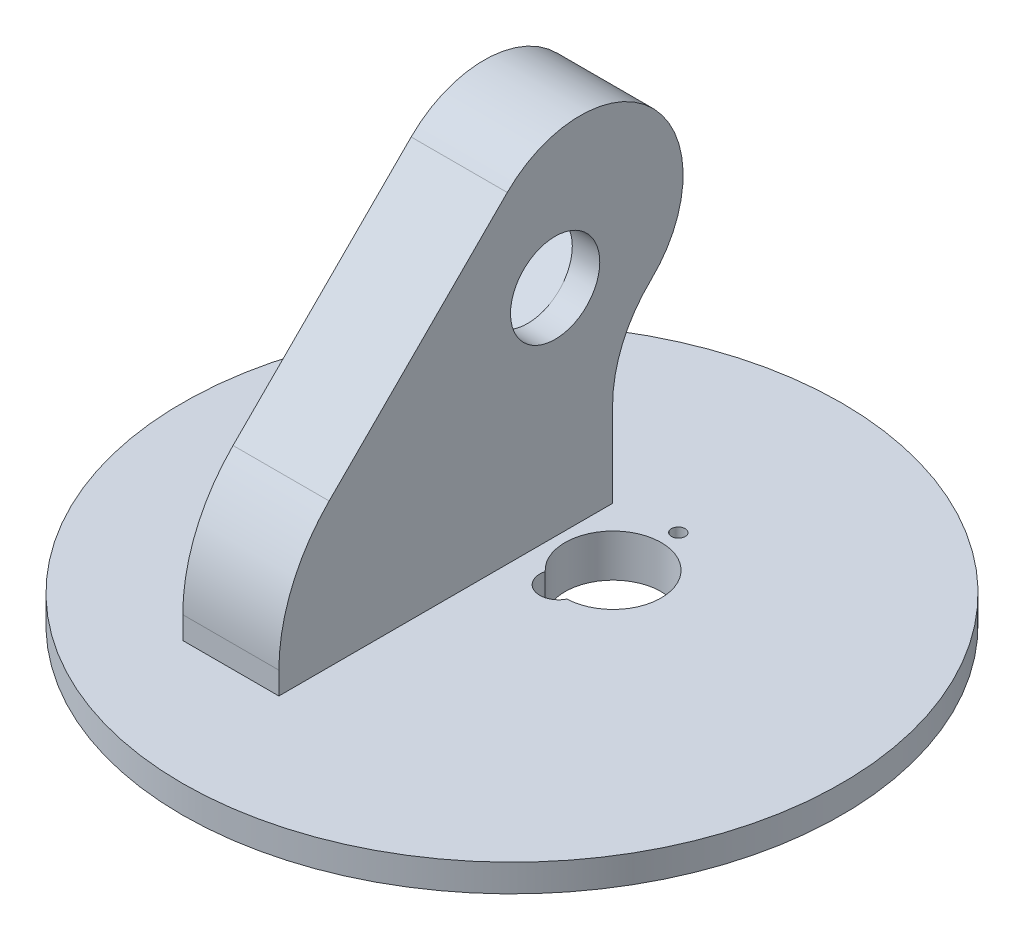
ISO-10303-21;
HEADER;
FILE_DESCRIPTION(('STEP AP214'),'2;1');
FILE_NAME('part.step','',(''),(''),'','','');
FILE_SCHEMA(('AUTOMOTIVE_DESIGN { 1 0 10303 214 1 1 1 1 }'));
ENDSEC;
DATA;
#1=APPLICATION_CONTEXT('core data for automotive mechanical design processes');
#2=APPLICATION_PROTOCOL_DEFINITION('international standard','automotive_design',2000,#1);
#3=PRODUCT_CONTEXT('',#1,'mechanical');
#4=PRODUCT('Part','Part','',(#3));
#5=PRODUCT_RELATED_PRODUCT_CATEGORY('part','',(#4));
#6=PRODUCT_DEFINITION_FORMATION('','',#4);
#7=PRODUCT_DEFINITION_CONTEXT('part definition',#1,'design');
#8=PRODUCT_DEFINITION('design','',#6,#7);
#9=PRODUCT_DEFINITION_SHAPE('','',#8);
#10=(LENGTH_UNIT() NAMED_UNIT(*) SI_UNIT(.MILLI.,.METRE.));
#11=(NAMED_UNIT(*) PLANE_ANGLE_UNIT() SI_UNIT($,.RADIAN.));
#12=(NAMED_UNIT(*) SI_UNIT($,.STERADIAN.) SOLID_ANGLE_UNIT());
#13=UNCERTAINTY_MEASURE_WITH_UNIT(LENGTH_MEASURE(1.E-05),#10,'distance_accuracy_value','');
#14=(GEOMETRIC_REPRESENTATION_CONTEXT(3) GLOBAL_UNCERTAINTY_ASSIGNED_CONTEXT((#13)) GLOBAL_UNIT_ASSIGNED_CONTEXT((#10,
#11,#12)) REPRESENTATION_CONTEXT('',''));
#15=CARTESIAN_POINT('',(0.,0.,0.));
#16=DIRECTION('',(0.,0.,1.));
#17=DIRECTION('',(1.,0.,0.));
#18=AXIS2_PLACEMENT_3D('',#15,#16,#17);
#19=CARTESIAN_POINT('',(-18.,0.,0.));
#20=DIRECTION('',(1.,0.,0.));
#21=DIRECTION('',(0.,0.,-1.));
#22=AXIS2_PLACEMENT_3D('',#19,#20,#21);
#23=PLANE('',#22);
#24=CARTESIAN_POINT('',(-18.,41.2645045857963,-17.0806200375207));
#25=DIRECTION('',(-1.,0.,0.));
#26=DIRECTION('',(0.,0.,1.));
#27=AXIS2_PLACEMENT_3D('',#24,#25,#26);
#28=CIRCLE('',#27,1.);
#29=CARTESIAN_POINT('',(-18.,41.2645045857963,-16.0806200375207));
#30=VERTEX_POINT('',#29);
#31=EDGE_CURVE('E180',#30,#30,#28,.T.);
#32=ORIENTED_EDGE('',*,*,#31,.F.);
#33=EDGE_LOOP('',(#32));
#34=FACE_BOUND('',#33,.T.);
#35=CARTESIAN_POINT('',(-18.,22.6925595294303,3.92944965370274));
#36=DIRECTION('',(-1.,0.,0.));
#37=DIRECTION('',(0.,0.,1.));
#38=AXIS2_PLACEMENT_3D('',#35,#36,#37);
#39=CIRCLE('',#38,0.999999999999999);
#40=CARTESIAN_POINT('',(-18.,22.6925595294303,4.92944965370274));
#41=VERTEX_POINT('',#40);
#42=EDGE_CURVE('E171',#41,#41,#39,.T.);
#43=ORIENTED_EDGE('',*,*,#42,.F.);
#44=EDGE_LOOP('',(#43));
#45=FACE_BOUND('',#44,.T.);
#46=DIRECTION('',(0.,0.707106781186544,-0.707106781186551));
#47=VECTOR('',#46,1.);
#48=CARTESIAN_POINT('',(-18.,23.7855886547707,23.7855886547705));
#49=LINE('',#48,#47);
#50=CARTESIAN_POINT('',(-18.,24.9400556402531,22.6311216692881));
#51=VERTEX_POINT('',#50);
#52=CARTESIAN_POINT('',(-18.,50.8830818937314,-3.31190458419046));
#53=VERTEX_POINT('',#52);
#54=EDGE_CURVE('E226',#51,#53,#49,.T.);
#55=ORIENTED_EDGE('',*,*,#54,.T.);
#56=CARTESIAN_POINT('',(-18.,40.2764801759331,-13.9185063019886));
#57=DIRECTION('',(1.,0.,0.));
#58=DIRECTION('',(0.,0.,-1.));
#59=AXIS2_PLACEMENT_3D('',#56,#57,#58);
#60=CIRCLE('',#59,15.);
#61=CARTESIAN_POINT('',(-18.,29.4035951531422,-24.2519651266595));
#62=VERTEX_POINT('',#61);
#63=EDGE_CURVE('E241',#62,#53,#60,.T.);
#64=ORIENTED_EDGE('',*,*,#63,.F.);
#65=CARTESIAN_POINT('',(-18.,16.356133125793,-36.6521157162645));
#66=DIRECTION('',(1.,0.,0.));
#67=DIRECTION('',(0.,0.,-1.));
#68=AXIS2_PLACEMENT_3D('',#65,#66,#67);
#69=CIRCLE('',#68,18.);
#70=CARTESIAN_POINT('',(-18.,16.356133125793,-18.6521157162645));
#71=VERTEX_POINT('',#70);
#72=EDGE_CURVE('E239',#62,#71,#69,.T.);
#73=ORIENTED_EDGE('',*,*,#72,.T.);
#74=DIRECTION('',(0.,-1.,0.));
#75=VECTOR('',#74,1.);
#76=CARTESIAN_POINT('',(-18.,0.,-18.6521157162645));
#77=LINE('',#76,#75);
#78=CARTESIAN_POINT('',(-18.,4.,-18.6521157162645));
#79=VERTEX_POINT('',#78);
#80=EDGE_CURVE('E236',#71,#79,#77,.T.);
#81=ORIENTED_EDGE('',*,*,#80,.T.);
#82=DIRECTION('',(0.,0.,-1.));
#83=VECTOR('',#82,1.);
#84=CARTESIAN_POINT('',(-18.,4.,0.));
#85=LINE('',#84,#83);
#86=CARTESIAN_POINT('',(-18.,4.,29.9534521396244));
#87=VERTEX_POINT('',#86);
#88=EDGE_CURVE('E234',#87,#79,#85,.T.);
#89=ORIENTED_EDGE('',*,*,#88,.F.);
#90=DIRECTION('',(0.,1.,0.));
#91=VECTOR('',#90,1.);
#92=CARTESIAN_POINT('',(-18.,-2.54836575938059E-13,29.9534521396244));
#93=LINE('',#92,#91);
#94=CARTESIAN_POINT('',(-18.,7.26238611058933,29.9534521396245));
#95=VERTEX_POINT('',#94);
#96=EDGE_CURVE('E232',#87,#95,#93,.T.);
#97=ORIENTED_EDGE('',*,*,#96,.T.);
#98=CARTESIAN_POINT('',(-18.,7.26238611058938,4.95345213962445));
#99=DIRECTION('',(1.,0.,0.));
#100=DIRECTION('',(0.,0.,-1.));
#101=AXIS2_PLACEMENT_3D('',#98,#99,#100);
#102=CIRCLE('',#101,25.);
#103=EDGE_CURVE('E228',#51,#95,#102,.T.);
#104=ORIENTED_EDGE('',*,*,#103,.F.);
#105=EDGE_LOOP('',(#55,#64,#73,#81,#89,#97,#104));
#106=FACE_BOUND('',#105,.T.);
#107=DIRECTION('',(0.,0.746307341756309,0.665601496122591));
#108=VECTOR('',#107,1.);
#109=CARTESIAN_POINT('',(-18.,34.8143999591404,-19.42779728588));
#110=LINE('',#109,#108);
#111=CARTESIAN_POINT('',(-18.,40.2181654592959,-14.6083962156254));
#112=VERTEX_POINT('',#111);
#113=CARTESIAN_POINT('',(-18.,44.5163954019724,-10.7749778362863));
#114=VERTEX_POINT('',#113);
#115=EDGE_CURVE('E179',#112,#114,#110,.T.);
#116=ORIENTED_EDGE('',*,*,#115,.T.);
#117=DIRECTION('',(0.,-0.665601496122591,0.746307341756309));
#118=VECTOR('',#117,1.);
#119=CARTESIAN_POINT('',(-18.,44.5163954019724,-10.7749778362863));
#120=LINE('',#119,#118);
#121=CARTESIAN_POINT('',(-18.,29.2075609911528,6.39009102410881));
#122=VERTEX_POINT('',#121);
#123=EDGE_CURVE('E204',#114,#122,#120,.T.);
#124=ORIENTED_EDGE('',*,*,#123,.T.);
#125=DIRECTION('',(0.,-0.746307341756309,-0.665601496122591));
#126=VECTOR('',#125,1.);
#127=CARTESIAN_POINT('',(-18.,29.2075609911528,6.39009102410881));
#128=LINE('',#127,#126);
#129=CARTESIAN_POINT('',(-18.,19.5055655483208,-2.26272842548487));
#130=VERTEX_POINT('',#129);
#131=EDGE_CURVE('E207',#122,#130,#128,.T.);
#132=ORIENTED_EDGE('',*,*,#131,.T.);
#133=DIRECTION('',(0.,0.665601496122591,-0.746307341756309));
#134=VECTOR('',#133,1.);
#135=CARTESIAN_POINT('',(-18.,19.5055655483208,-2.26272842548487));
#136=LINE('',#135,#134);
#137=CARTESIAN_POINT('',(-18.,34.8143999591404,-19.42779728588));
#138=VERTEX_POINT('',#137);
#139=EDGE_CURVE('E210',#130,#138,#136,.T.);
#140=ORIENTED_EDGE('',*,*,#139,.T.);
#141=CARTESIAN_POINT('',(-18.,39.1126299018168,-15.5943789065408));
#142=VERTEX_POINT('',#141);
#143=EDGE_CURVE('E201',#138,#142,#110,.T.);
#144=ORIENTED_EDGE('',*,*,#143,.T.);
#145=CARTESIAN_POINT('',(-18.,35.3671677378799,-10.2819864908286));
#146=DIRECTION('',(-1.,0.,0.));
#147=DIRECTION('',(0.,0.,1.));
#148=AXIS2_PLACEMENT_3D('',#145,#146,#147);
#149=CIRCLE('',#148,6.5);
#150=EDGE_CURVE('E222',#112,#142,#149,.T.);
#151=ORIENTED_EDGE('',*,*,#150,.F.);
#152=EDGE_LOOP('',(#116,#124,#132,#140,#144,#151));
#153=FACE_BOUND('',#152,.T.);
#154=ADVANCED_FACE('F37',(#34,#45,#106,#153),#23,.F.);
#155=CARTESIAN_POINT('',(48.,35.3671677378799,-10.2819864908286));
#156=DIRECTION('',(-1.,0.,0.));
#157=DIRECTION('',(0.,0.,1.));
#158=AXIS2_PLACEMENT_3D('',#155,#156,#157);
#159=CYLINDRICAL_SURFACE('',#158,6.5);
#160=CARTESIAN_POINT('',(-4.,35.3671677378799,-10.2819864908286));
#161=DIRECTION('',(1.,0.,0.));
#162=DIRECTION('',(0.,0.,-1.));
#163=AXIS2_PLACEMENT_3D('',#160,#161,#162);
#164=CIRCLE('',#163,6.5);
#165=CARTESIAN_POINT('',(-4.,35.3671677378799,-16.7819864908286));
#166=VERTEX_POINT('',#165);
#167=EDGE_CURVE('E225',#166,#166,#164,.T.);
#168=ORIENTED_EDGE('',*,*,#167,.T.);
#169=EDGE_LOOP('',(#168));
#170=FACE_BOUND('',#169,.T.);
#171=DIRECTION('',(-1.,0.,0.));
#172=VECTOR('',#171,1.);
#173=CARTESIAN_POINT('',(48.,40.2181654592959,-14.6083962156254));
#174=LINE('',#173,#172);
#175=CARTESIAN_POINT('',(-8.,40.2181654592959,-14.6083962156254));
#176=VERTEX_POINT('',#175);
#177=EDGE_CURVE('E175',#112,#176,#174,.F.);
#178=ORIENTED_EDGE('',*,*,#177,.F.);
#179=ORIENTED_EDGE('',*,*,#150,.T.);
#180=DIRECTION('',(-1.,0.,0.));
#181=VECTOR('',#180,1.);
#182=CARTESIAN_POINT('',(48.,39.1126299018168,-15.5943789065408));
#183=LINE('',#182,#181);
#184=CARTESIAN_POINT('',(-8.,39.1126299018168,-15.5943789065408));
#185=VERTEX_POINT('',#184);
#186=EDGE_CURVE('E292',#185,#142,#183,.T.);
#187=ORIENTED_EDGE('',*,*,#186,.F.);
#188=CARTESIAN_POINT('',(-8.,35.3671677378799,-10.2819864908286));
#189=DIRECTION('',(1.,0.,0.));
#190=DIRECTION('',(0.,0.,-1.));
#191=AXIS2_PLACEMENT_3D('',#188,#189,#190);
#192=CIRCLE('',#191,6.5);
#193=CARTESIAN_POINT('',(-8.,30.5161700164639,-14.6083962156254));
#194=VERTEX_POINT('',#193);
#195=EDGE_CURVE('E283',#185,#194,#192,.F.);
#196=ORIENTED_EDGE('',*,*,#195,.T.);
#197=CARTESIAN_POINT('',(-8.,40.2181654592959,-5.95557676603175));
#198=VERTEX_POINT('',#197);
#199=EDGE_CURVE('E290',#194,#198,#192,.F.);
#200=ORIENTED_EDGE('',*,*,#199,.T.);
#201=EDGE_CURVE('E291',#198,#176,#192,.F.);
#202=ORIENTED_EDGE('',*,*,#201,.T.);
#203=EDGE_LOOP('',(#178,#179,#187,#196,#200,#202));
#204=FACE_BOUND('',#203,.T.);
#205=ADVANCED_FACE('F319',(#170,#204),#159,.F.);
#206=CARTESIAN_POINT('',(0.,4.,0.));
#207=DIRECTION('',(0.,1.,0.));
#208=DIRECTION('',(0.,0.,1.));
#209=AXIS2_PLACEMENT_3D('',#206,#207,#208);
#210=PLANE('',#209);
#211=CARTESIAN_POINT('',(4.47268387529148,4.,-19.7508750439158));
#212=DIRECTION('',(0.,1.,0.));
#213=DIRECTION('',(0.,0.,1.));
#214=AXIS2_PLACEMENT_3D('',#211,#212,#213);
#215=CIRCLE('',#214,1.);
#216=CARTESIAN_POINT('',(4.47268387529148,4.,-18.7508750439158));
#217=VERTEX_POINT('',#216);
#218=EDGE_CURVE('E693',#217,#217,#215,.T.);
#219=ORIENTED_EDGE('',*,*,#218,.F.);
#220=EDGE_LOOP('',(#219));
#221=FACE_BOUND('',#220,.T.);
#222=CARTESIAN_POINT('',(2.31007172810394,4.,-4.44411520885168));
#223=DIRECTION('',(0.,1.,0.));
#224=DIRECTION('',(0.,0.,1.));
#225=AXIS2_PLACEMENT_3D('',#222,#223,#224);
#226=CIRCLE('',#225,2.70181828281147);
#227=CARTESIAN_POINT('',(-0.302561137912072,4.,-5.13257111938432));
#228=VERTEX_POINT('',#227);
#229=CARTESIAN_POINT('',(4.73656073645436,4.,-3.25585045481371));
#230=VERTEX_POINT('',#229);
#231=EDGE_CURVE('E149',#228,#230,#226,.T.);
#232=ORIENTED_EDGE('',*,*,#231,.F.);
#233=CARTESIAN_POINT('',(4.4726838752915,4.,-10.2508750439158));
#234=DIRECTION('',(0.,1.,0.));
#235=DIRECTION('',(0.,0.,1.));
#236=AXIS2_PLACEMENT_3D('',#233,#234,#235);
#237=CIRCLE('',#236,7.);
#238=EDGE_CURVE('E159',#230,#228,#237,.T.);
#239=ORIENTED_EDGE('',*,*,#238,.F.);
#240=EDGE_LOOP('',(#232,#239));
#241=FACE_BOUND('',#240,.T.);
#242=CARTESIAN_POINT('',(0.,4.,0.));
#243=DIRECTION('',(0.,1.,0.));
#244=DIRECTION('',(0.,0.,1.));
#245=AXIS2_PLACEMENT_3D('',#242,#243,#244);
#246=CIRCLE('',#245,48.);
#247=CARTESIAN_POINT('',(0.,4.,48.));
#248=VERTEX_POINT('',#247);
#249=EDGE_CURVE('E280',#248,#248,#246,.T.);
#250=ORIENTED_EDGE('',*,*,#249,.T.);
#251=EDGE_LOOP('',(#250));
#252=FACE_BOUND('',#251,.T.);
#253=DIRECTION('',(1.,0.,0.));
#254=VECTOR('',#253,1.);
#255=CARTESIAN_POINT('',(-18.,4.,29.9534521396245));
#256=LINE('',#255,#254);
#257=CARTESIAN_POINT('',(-4.,4.,29.9534521396245));
#258=VERTEX_POINT('',#257);
#259=EDGE_CURVE('E274',#87,#258,#256,.T.);
#260=ORIENTED_EDGE('',*,*,#259,.F.);
#261=ORIENTED_EDGE('',*,*,#88,.T.);
#262=DIRECTION('',(1.,0.,0.));
#263=VECTOR('',#262,1.);
#264=CARTESIAN_POINT('',(-18.,4.,-18.6521157162645));
#265=LINE('',#264,#263);
#266=CARTESIAN_POINT('',(-4.,4.,-18.6521157162645));
#267=VERTEX_POINT('',#266);
#268=EDGE_CURVE('E272',#79,#267,#265,.T.);
#269=ORIENTED_EDGE('',*,*,#268,.T.);
#270=DIRECTION('',(0.,0.,-1.));
#271=VECTOR('',#270,1.);
#272=CARTESIAN_POINT('',(-4.,4.,0.));
#273=LINE('',#272,#271);
#274=EDGE_CURVE('E254',#258,#267,#273,.T.);
#275=ORIENTED_EDGE('',*,*,#274,.F.);
#276=EDGE_LOOP('',(#260,#261,#269,#275));
#277=FACE_BOUND('',#276,.T.);
#278=ADVANCED_FACE('F162',(#221,#241,#252,#277),#210,.T.);
#279=CARTESIAN_POINT('',(0.,4.,0.));
#280=DIRECTION('',(0.,-1.,0.));
#281=DIRECTION('',(0.,0.,-1.));
#282=AXIS2_PLACEMENT_3D('',#279,#280,#281);
#283=CYLINDRICAL_SURFACE('',#282,48.);
#284=ORIENTED_EDGE('',*,*,#249,.F.);
#285=EDGE_LOOP('',(#284));
#286=FACE_BOUND('',#285,.T.);
#287=CARTESIAN_POINT('',(0.,0.,0.));
#288=DIRECTION('',(0.,1.,0.));
#289=DIRECTION('',(0.,0.,1.));
#290=AXIS2_PLACEMENT_3D('',#287,#288,#289);
#291=CIRCLE('',#290,48.);
#292=CARTESIAN_POINT('',(0.,0.,48.));
#293=VERTEX_POINT('',#292);
#294=EDGE_CURVE('E266',#293,#293,#291,.T.);
#295=ORIENTED_EDGE('',*,*,#294,.T.);
#296=EDGE_LOOP('',(#295));
#297=FACE_BOUND('',#296,.T.);
#298=ADVANCED_FACE('F39',(#286,#297),#283,.T.);
#299=CARTESIAN_POINT('',(0.,0.,0.));
#300=DIRECTION('',(0.,1.,0.));
#301=DIRECTION('',(0.,0.,1.));
#302=AXIS2_PLACEMENT_3D('',#299,#300,#301);
#303=PLANE('',#302);
#304=CARTESIAN_POINT('',(0.,0.,0.));
#305=DIRECTION('',(0.,-1.,0.));
#306=DIRECTION('',(0.,0.,-1.));
#307=AXIS2_PLACEMENT_3D('',#304,#305,#306);
#308=CIRCLE('',#307,43.5);
#309=CARTESIAN_POINT('',(0.,0.,-43.5));
#310=VERTEX_POINT('',#309);
#311=EDGE_CURVE('E172',#310,#310,#308,.T.);
#312=ORIENTED_EDGE('',*,*,#311,.F.);
#313=EDGE_LOOP('',(#312));
#314=FACE_BOUND('',#313,.T.);
#315=ORIENTED_EDGE('',*,*,#294,.F.);
#316=EDGE_LOOP('',(#315));
#317=FACE_BOUND('',#316,.T.);
#318=ADVANCED_FACE('F308',(#314,#317),#303,.F.);
#319=CARTESIAN_POINT('',(-18.,23.7855886547707,23.7855886547705));
#320=DIRECTION('',(0.,-0.707106781186551,-0.707106781186544));
#321=DIRECTION('',(0.,0.707106781186544,-0.707106781186551));
#322=AXIS2_PLACEMENT_3D('',#319,#320,#321);
#323=PLANE('',#322);
#324=DIRECTION('',(0.,0.707106781186544,-0.707106781186551));
#325=VECTOR('',#324,1.);
#326=CARTESIAN_POINT('',(-4.,23.7855886547707,23.7855886547705));
#327=LINE('',#326,#325);
#328=CARTESIAN_POINT('',(-4.,24.9400556402531,22.6311216692881));
#329=VERTEX_POINT('',#328);
#330=CARTESIAN_POINT('',(-4.,50.8830818937314,-3.31190458419046));
#331=VERTEX_POINT('',#330);
#332=EDGE_CURVE('E245',#329,#331,#327,.T.);
#333=ORIENTED_EDGE('',*,*,#332,.T.);
#334=DIRECTION('',(1.,0.,0.));
#335=VECTOR('',#334,1.);
#336=CARTESIAN_POINT('',(-18.,50.8830818937314,-3.31190458419046));
#337=LINE('',#336,#335);
#338=EDGE_CURVE('E264',#53,#331,#337,.T.);
#339=ORIENTED_EDGE('',*,*,#338,.F.);
#340=ORIENTED_EDGE('',*,*,#54,.F.);
#341=DIRECTION('',(1.,0.,0.));
#342=VECTOR('',#341,1.);
#343=CARTESIAN_POINT('',(-18.,24.9400556402531,22.6311216692881));
#344=LINE('',#343,#342);
#345=EDGE_CURVE('E244',#51,#329,#344,.T.);
#346=ORIENTED_EDGE('',*,*,#345,.T.);
#347=EDGE_LOOP('',(#333,#339,#340,#346));
#348=FACE_BOUND('',#347,.T.);
#349=ADVANCED_FACE('F311',(#348),#323,.F.);
#350=CARTESIAN_POINT('',(-18.,40.2764801759331,-13.9185063019886));
#351=DIRECTION('',(1.,0.,0.));
#352=DIRECTION('',(0.,0.,-1.));
#353=AXIS2_PLACEMENT_3D('',#350,#351,#352);
#354=CYLINDRICAL_SURFACE('',#353,15.);
#355=CARTESIAN_POINT('',(-4.,40.2764801759331,-13.9185063019886));
#356=DIRECTION('',(1.,0.,0.));
#357=DIRECTION('',(0.,0.,-1.));
#358=AXIS2_PLACEMENT_3D('',#355,#356,#357);
#359=CIRCLE('',#358,15.);
#360=CARTESIAN_POINT('',(-4.,29.4035951531422,-24.2519651266595));
#361=VERTEX_POINT('',#360);
#362=EDGE_CURVE('E229',#361,#331,#359,.T.);
#363=ORIENTED_EDGE('',*,*,#362,.F.);
#364=DIRECTION('',(1.,0.,0.));
#365=VECTOR('',#364,1.);
#366=CARTESIAN_POINT('',(-18.,29.4035951531422,-24.2519651266595));
#367=LINE('',#366,#365);
#368=EDGE_CURVE('E267',#62,#361,#367,.T.);
#369=ORIENTED_EDGE('',*,*,#368,.F.);
#370=ORIENTED_EDGE('',*,*,#63,.T.);
#371=ORIENTED_EDGE('',*,*,#338,.T.);
#372=EDGE_LOOP('',(#363,#369,#370,#371));
#373=FACE_BOUND('',#372,.T.);
#374=ADVANCED_FACE('F341',(#373),#354,.T.);
#375=CARTESIAN_POINT('',(-18.,16.356133125793,-36.6521157162645));
#376=DIRECTION('',(1.,0.,0.));
#377=DIRECTION('',(0.,0.,-1.));
#378=AXIS2_PLACEMENT_3D('',#375,#376,#377);
#379=CYLINDRICAL_SURFACE('',#378,18.);
#380=CARTESIAN_POINT('',(-4.,16.356133125793,-36.6521157162645));
#381=DIRECTION('',(1.,0.,0.));
#382=DIRECTION('',(0.,0.,-1.));
#383=AXIS2_PLACEMENT_3D('',#380,#381,#382);
#384=CIRCLE('',#383,18.);
#385=CARTESIAN_POINT('',(-4.,16.356133125793,-18.6521157162645));
#386=VERTEX_POINT('',#385);
#387=EDGE_CURVE('E260',#361,#386,#384,.T.);
#388=ORIENTED_EDGE('',*,*,#387,.T.);
#389=DIRECTION('',(1.,0.,0.));
#390=VECTOR('',#389,1.);
#391=CARTESIAN_POINT('',(-18.,16.356133125793,-18.6521157162645));
#392=LINE('',#391,#390);
#393=EDGE_CURVE('E269',#71,#386,#392,.T.);
#394=ORIENTED_EDGE('',*,*,#393,.F.);
#395=ORIENTED_EDGE('',*,*,#72,.F.);
#396=ORIENTED_EDGE('',*,*,#368,.T.);
#397=EDGE_LOOP('',(#388,#394,#395,#396));
#398=FACE_BOUND('',#397,.T.);
#399=ADVANCED_FACE('F344',(#398),#379,.F.);
#400=CARTESIAN_POINT('',(-18.,0.,-18.6521157162645));
#401=DIRECTION('',(0.,0.,1.));
#402=DIRECTION('',(0.,-1.,0.));
#403=AXIS2_PLACEMENT_3D('',#400,#401,#402);
#404=PLANE('',#403);
#405=DIRECTION('',(0.,-1.,0.));
#406=VECTOR('',#405,1.);
#407=CARTESIAN_POINT('',(-4.,0.,-18.6521157162645));
#408=LINE('',#407,#406);
#409=EDGE_CURVE('E257',#386,#267,#408,.T.);
#410=ORIENTED_EDGE('',*,*,#409,.T.);
#411=ORIENTED_EDGE('',*,*,#268,.F.);
#412=ORIENTED_EDGE('',*,*,#80,.F.);
#413=ORIENTED_EDGE('',*,*,#393,.T.);
#414=EDGE_LOOP('',(#410,#411,#412,#413));
#415=FACE_BOUND('',#414,.T.);
#416=ADVANCED_FACE('F348',(#415),#404,.F.);
#417=CARTESIAN_POINT('',(-18.,-2.54836575938059E-13,29.9534521396244));
#418=DIRECTION('',(0.,0.,-1.));
#419=DIRECTION('',(0.,1.,0.));
#420=AXIS2_PLACEMENT_3D('',#417,#418,#419);
#421=PLANE('',#420);
#422=DIRECTION('',(0.,1.,0.));
#423=VECTOR('',#422,1.);
#424=CARTESIAN_POINT('',(-4.,-2.54836575938059E-13,29.9534521396244));
#425=LINE('',#424,#423);
#426=CARTESIAN_POINT('',(-4.,7.26238611058933,29.9534521396245));
#427=VERTEX_POINT('',#426);
#428=EDGE_CURVE('E251',#258,#427,#425,.T.);
#429=ORIENTED_EDGE('',*,*,#428,.T.);
#430=DIRECTION('',(1.,0.,0.));
#431=VECTOR('',#430,1.);
#432=CARTESIAN_POINT('',(-18.,7.26238611058933,29.9534521396245));
#433=LINE('',#432,#431);
#434=EDGE_CURVE('E277',#95,#427,#433,.T.);
#435=ORIENTED_EDGE('',*,*,#434,.F.);
#436=ORIENTED_EDGE('',*,*,#96,.F.);
#437=ORIENTED_EDGE('',*,*,#259,.T.);
#438=EDGE_LOOP('',(#429,#435,#436,#437));
#439=FACE_BOUND('',#438,.T.);
#440=ADVANCED_FACE('F352',(#439),#421,.F.);
#441=CARTESIAN_POINT('',(-18.,7.26238611058938,4.95345213962445));
#442=DIRECTION('',(1.,0.,0.));
#443=DIRECTION('',(0.,0.,-1.));
#444=AXIS2_PLACEMENT_3D('',#441,#442,#443);
#445=CYLINDRICAL_SURFACE('',#444,25.);
#446=CARTESIAN_POINT('',(-4.,7.26238611058938,4.95345213962445));
#447=DIRECTION('',(1.,0.,0.));
#448=DIRECTION('',(0.,0.,-1.));
#449=AXIS2_PLACEMENT_3D('',#446,#447,#448);
#450=CIRCLE('',#449,25.);
#451=EDGE_CURVE('E248',#329,#427,#450,.T.);
#452=ORIENTED_EDGE('',*,*,#451,.F.);
#453=ORIENTED_EDGE('',*,*,#345,.F.);
#454=ORIENTED_EDGE('',*,*,#103,.T.);
#455=ORIENTED_EDGE('',*,*,#434,.T.);
#456=EDGE_LOOP('',(#452,#453,#454,#455));
#457=FACE_BOUND('',#456,.T.);
#458=ADVANCED_FACE('F339',(#457),#445,.T.);
#459=CARTESIAN_POINT('',(-4.,0.,0.));
#460=DIRECTION('',(1.,0.,0.));
#461=DIRECTION('',(0.,0.,-1.));
#462=AXIS2_PLACEMENT_3D('',#459,#460,#461);
#463=PLANE('',#462);
#464=ORIENTED_EDGE('',*,*,#167,.F.);
#465=EDGE_LOOP('',(#464));
#466=FACE_BOUND('',#465,.T.);
#467=ORIENTED_EDGE('',*,*,#332,.F.);
#468=ORIENTED_EDGE('',*,*,#451,.T.);
#469=ORIENTED_EDGE('',*,*,#428,.F.);
#470=ORIENTED_EDGE('',*,*,#274,.T.);
#471=ORIENTED_EDGE('',*,*,#409,.F.);
#472=ORIENTED_EDGE('',*,*,#387,.F.);
#473=ORIENTED_EDGE('',*,*,#362,.T.);
#474=EDGE_LOOP('',(#467,#468,#469,#470,#471,#472,#473));
#475=FACE_BOUND('',#474,.T.);
#476=ADVANCED_FACE('F335',(#466,#475),#463,.T.);
#477=CARTESIAN_POINT('',(-8.,34.8143999591404,-19.42779728588));
#478=DIRECTION('',(0.,-0.665601496122591,0.746307341756309));
#479=DIRECTION('',(0.,-0.746307341756309,-0.665601496122591));
#480=AXIS2_PLACEMENT_3D('',#477,#478,#479);
#481=PLANE('',#480);
#482=ORIENTED_EDGE('',*,*,#177,.T.);
#483=DIRECTION('',(0.,0.746307341756309,0.665601496122591));
#484=VECTOR('',#483,1.);
#485=CARTESIAN_POINT('',(-8.,34.8143999591404,-19.42779728588));
#486=LINE('',#485,#484);
#487=CARTESIAN_POINT('',(-8.,44.5163954019724,-10.7749778362863));
#488=VERTEX_POINT('',#487);
#489=EDGE_CURVE('E192',#176,#488,#486,.T.);
#490=ORIENTED_EDGE('',*,*,#489,.T.);
#491=DIRECTION('',(-1.,0.,0.));
#492=VECTOR('',#491,1.);
#493=CARTESIAN_POINT('',(-8.,44.5163954019724,-10.7749778362863));
#494=LINE('',#493,#492);
#495=EDGE_CURVE('E219',#488,#114,#494,.T.);
#496=ORIENTED_EDGE('',*,*,#495,.T.);
#497=ORIENTED_EDGE('',*,*,#115,.F.);
#498=EDGE_LOOP('',(#482,#490,#496,#497));
#499=FACE_BOUND('',#498,.T.);
#500=ADVANCED_FACE('F338',(#499),#481,.T.);
#501=ORIENTED_EDGE('',*,*,#186,.T.);
#502=ORIENTED_EDGE('',*,*,#143,.F.);
#503=DIRECTION('',(-1.,0.,0.));
#504=VECTOR('',#503,1.);
#505=CARTESIAN_POINT('',(-8.,34.8143999591404,-19.42779728588));
#506=LINE('',#505,#504);
#507=CARTESIAN_POINT('',(-8.,34.8143999591404,-19.42779728588));
#508=VERTEX_POINT('',#507);
#509=EDGE_CURVE('E200',#508,#138,#506,.T.);
#510=ORIENTED_EDGE('',*,*,#509,.F.);
#511=EDGE_CURVE('E188',#508,#185,#486,.T.);
#512=ORIENTED_EDGE('',*,*,#511,.T.);
#513=EDGE_LOOP('',(#501,#502,#510,#512));
#514=FACE_BOUND('',#513,.T.);
#515=ADVANCED_FACE('F414',(#514),#481,.T.);
#516=CARTESIAN_POINT('',(-8.,44.5163954019724,-10.7749778362863));
#517=DIRECTION('',(0.,-0.746307341756309,-0.665601496122591));
#518=DIRECTION('',(0.,0.665601496122591,-0.746307341756309));
#519=AXIS2_PLACEMENT_3D('',#516,#517,#518);
#520=PLANE('',#519);
#521=ORIENTED_EDGE('',*,*,#123,.F.);
#522=ORIENTED_EDGE('',*,*,#495,.F.);
#523=DIRECTION('',(0.,-0.665601496122591,0.746307341756309));
#524=VECTOR('',#523,1.);
#525=CARTESIAN_POINT('',(-8.,44.5163954019724,-10.7749778362863));
#526=LINE('',#525,#524);
#527=EDGE_CURVE('E193',#488,#198,#526,.T.);
#528=ORIENTED_EDGE('',*,*,#527,.T.);
#529=CARTESIAN_POINT('',(-8.,29.2075609911528,6.39009102410881));
#530=VERTEX_POINT('',#529);
#531=EDGE_CURVE('E191',#198,#530,#526,.T.);
#532=ORIENTED_EDGE('',*,*,#531,.T.);
#533=DIRECTION('',(-1.,0.,0.));
#534=VECTOR('',#533,1.);
#535=CARTESIAN_POINT('',(-8.,29.2075609911528,6.39009102410881));
#536=LINE('',#535,#534);
#537=EDGE_CURVE('E217',#530,#122,#536,.T.);
#538=ORIENTED_EDGE('',*,*,#537,.T.);
#539=EDGE_LOOP('',(#521,#522,#528,#532,#538));
#540=FACE_BOUND('',#539,.T.);
#541=ADVANCED_FACE('F405',(#540),#520,.T.);
#542=CARTESIAN_POINT('',(-8.,19.5055655483208,-2.26272842548487));
#543=DIRECTION('',(0.,0.746307341756309,0.665601496122591));
#544=DIRECTION('',(0.,-0.665601496122591,0.746307341756309));
#545=AXIS2_PLACEMENT_3D('',#542,#543,#544);
#546=PLANE('',#545);
#547=ORIENTED_EDGE('',*,*,#139,.F.);
#548=DIRECTION('',(-1.,0.,0.));
#549=VECTOR('',#548,1.);
#550=CARTESIAN_POINT('',(-8.,19.5055655483208,-2.26272842548487));
#551=LINE('',#550,#549);
#552=CARTESIAN_POINT('',(-8.,19.5055655483208,-2.26272842548487));
#553=VERTEX_POINT('',#552);
#554=EDGE_CURVE('E214',#553,#130,#551,.T.);
#555=ORIENTED_EDGE('',*,*,#554,.F.);
#556=DIRECTION('',(0.,0.665601496122591,-0.746307341756309));
#557=VECTOR('',#556,1.);
#558=CARTESIAN_POINT('',(-8.,19.5055655483208,-2.26272842548487));
#559=LINE('',#558,#557);
#560=EDGE_CURVE('E60',#553,#194,#559,.T.);
#561=ORIENTED_EDGE('',*,*,#560,.T.);
#562=EDGE_CURVE('E198',#194,#508,#559,.T.);
#563=ORIENTED_EDGE('',*,*,#562,.T.);
#564=ORIENTED_EDGE('',*,*,#509,.T.);
#565=EDGE_LOOP('',(#547,#555,#561,#563,#564));
#566=FACE_BOUND('',#565,.T.);
#567=ADVANCED_FACE('F410',(#566),#546,.T.);
#568=CARTESIAN_POINT('',(-8.,0.,0.));
#569=DIRECTION('',(1.,0.,0.));
#570=DIRECTION('',(0.,0.,-1.));
#571=AXIS2_PLACEMENT_3D('',#568,#569,#570);
#572=PLANE('',#571);
#573=ORIENTED_EDGE('',*,*,#527,.F.);
#574=ORIENTED_EDGE('',*,*,#489,.F.);
#575=ORIENTED_EDGE('',*,*,#201,.F.);
#576=EDGE_LOOP('',(#573,#574,#575));
#577=FACE_BOUND('',#576,.T.);
#578=ADVANCED_FACE('F399',(#577),#572,.F.);
#579=ORIENTED_EDGE('',*,*,#560,.F.);
#580=DIRECTION('',(0.,-0.746307341756309,-0.665601496122591));
#581=VECTOR('',#580,1.);
#582=CARTESIAN_POINT('',(-8.,29.2075609911528,6.39009102410881));
#583=LINE('',#582,#581);
#584=EDGE_CURVE('E196',#530,#553,#583,.T.);
#585=ORIENTED_EDGE('',*,*,#584,.F.);
#586=ORIENTED_EDGE('',*,*,#531,.F.);
#587=ORIENTED_EDGE('',*,*,#199,.F.);
#588=EDGE_LOOP('',(#579,#585,#586,#587));
#589=FACE_BOUND('',#588,.T.);
#590=ADVANCED_FACE('F402',(#589),#572,.F.);
#591=ORIENTED_EDGE('',*,*,#511,.F.);
#592=ORIENTED_EDGE('',*,*,#562,.F.);
#593=ORIENTED_EDGE('',*,*,#195,.F.);
#594=EDGE_LOOP('',(#591,#592,#593));
#595=FACE_BOUND('',#594,.T.);
#596=ADVANCED_FACE('F416',(#595),#572,.F.);
#597=CARTESIAN_POINT('',(-8.,29.2075609911528,6.39009102410881));
#598=DIRECTION('',(0.,0.665601496122591,-0.746307341756309));
#599=DIRECTION('',(0.,0.746307341756309,0.665601496122591));
#600=AXIS2_PLACEMENT_3D('',#597,#598,#599);
#601=PLANE('',#600);
#602=ORIENTED_EDGE('',*,*,#131,.F.);
#603=ORIENTED_EDGE('',*,*,#537,.F.);
#604=ORIENTED_EDGE('',*,*,#584,.T.);
#605=ORIENTED_EDGE('',*,*,#554,.T.);
#606=EDGE_LOOP('',(#602,#603,#604,#605));
#607=FACE_BOUND('',#606,.T.);
#608=ADVANCED_FACE('F408',(#607),#601,.T.);
#609=CARTESIAN_POINT('',(-13.5,22.6925595294303,3.92944965370274));
#610=DIRECTION('',(-1.,0.,0.));
#611=DIRECTION('',(0.,0.,1.));
#612=AXIS2_PLACEMENT_3D('',#609,#610,#611);
#613=CYLINDRICAL_SURFACE('',#612,0.999999999999999);
#614=CARTESIAN_POINT('',(-13.5,22.6925595294303,3.92944965370274));
#615=DIRECTION('',(-1.,0.,0.));
#616=DIRECTION('',(0.,0.,1.));
#617=AXIS2_PLACEMENT_3D('',#614,#615,#616);
#618=CIRCLE('',#617,0.999999999999999);
#619=CARTESIAN_POINT('',(-13.5,22.6925595294303,4.92944965370274));
#620=VERTEX_POINT('',#619);
#621=EDGE_CURVE('E183',#620,#620,#618,.T.);
#622=ORIENTED_EDGE('',*,*,#621,.F.);
#623=EDGE_LOOP('',(#622));
#624=FACE_BOUND('',#623,.T.);
#625=ORIENTED_EDGE('',*,*,#42,.T.);
#626=EDGE_LOOP('',(#625));
#627=FACE_BOUND('',#626,.T.);
#628=ADVANCED_FACE('F423',(#624,#627),#613,.F.);
#629=CARTESIAN_POINT('',(-13.5,22.6925595294303,3.92944965370274));
#630=DIRECTION('',(-1.,0.,0.));
#631=DIRECTION('',(0.,0.,1.));
#632=AXIS2_PLACEMENT_3D('',#629,#630,#631);
#633=PLANE('',#632);
#634=ORIENTED_EDGE('',*,*,#621,.T.);
#635=EDGE_LOOP('',(#634));
#636=FACE_BOUND('',#635,.T.);
#637=ADVANCED_FACE('F534',(#636),#633,.T.);
#638=CARTESIAN_POINT('',(-13.5,41.2645045857963,-17.0806200375207));
#639=DIRECTION('',(-1.,0.,0.));
#640=DIRECTION('',(0.,0.,1.));
#641=AXIS2_PLACEMENT_3D('',#638,#639,#640);
#642=CYLINDRICAL_SURFACE('',#641,1.);
#643=CARTESIAN_POINT('',(-13.5,41.2645045857963,-17.0806200375207));
#644=DIRECTION('',(-1.,0.,0.));
#645=DIRECTION('',(0.,0.,1.));
#646=AXIS2_PLACEMENT_3D('',#643,#644,#645);
#647=CIRCLE('',#646,1.);
#648=CARTESIAN_POINT('',(-13.5,41.2645045857963,-16.0806200375207));
#649=VERTEX_POINT('',#648);
#650=EDGE_CURVE('E176',#649,#649,#647,.T.);
#651=ORIENTED_EDGE('',*,*,#650,.F.);
#652=EDGE_LOOP('',(#651));
#653=FACE_BOUND('',#652,.T.);
#654=ORIENTED_EDGE('',*,*,#31,.T.);
#655=EDGE_LOOP('',(#654));
#656=FACE_BOUND('',#655,.T.);
#657=ADVANCED_FACE('F530',(#653,#656),#642,.F.);
#658=CARTESIAN_POINT('',(-13.5,41.2645045857963,-17.0806200375207));
#659=DIRECTION('',(-1.,0.,0.));
#660=DIRECTION('',(0.,0.,1.));
#661=AXIS2_PLACEMENT_3D('',#658,#659,#660);
#662=PLANE('',#661);
#663=ORIENTED_EDGE('',*,*,#650,.T.);
#664=EDGE_LOOP('',(#663));
#665=FACE_BOUND('',#664,.T.);
#666=ADVANCED_FACE('F304',(#665),#662,.T.);
#667=CARTESIAN_POINT('',(0.,-2.2,0.));
#668=DIRECTION('',(0.,1.,0.));
#669=DIRECTION('',(0.,0.,1.));
#670=AXIS2_PLACEMENT_3D('',#667,#668,#669);
#671=CYLINDRICAL_SURFACE('',#670,43.5);
#672=CARTESIAN_POINT('',(0.,-2.2,0.));
#673=DIRECTION('',(0.,-1.,0.));
#674=DIRECTION('',(0.,0.,-1.));
#675=AXIS2_PLACEMENT_3D('',#672,#673,#674);
#676=CIRCLE('',#675,43.5);
#677=CARTESIAN_POINT('',(0.,-2.2,-43.5));
#678=VERTEX_POINT('',#677);
#679=EDGE_CURVE('E165',#678,#678,#676,.T.);
#680=ORIENTED_EDGE('',*,*,#679,.F.);
#681=EDGE_LOOP('',(#680));
#682=FACE_BOUND('',#681,.T.);
#683=ORIENTED_EDGE('',*,*,#311,.T.);
#684=EDGE_LOOP('',(#683));
#685=FACE_BOUND('',#684,.T.);
#686=ADVANCED_FACE('F298',(#682,#685),#671,.T.);
#687=CARTESIAN_POINT('',(0.,-2.2,0.));
#688=DIRECTION('',(0.,-1.,0.));
#689=DIRECTION('',(0.,0.,-1.));
#690=AXIS2_PLACEMENT_3D('',#687,#688,#689);
#691=PLANE('',#690);
#692=CARTESIAN_POINT('',(2.31007172810394,-2.2,-4.44411520885168));
#693=DIRECTION('',(0.,1.,0.));
#694=DIRECTION('',(0.,0.,1.));
#695=AXIS2_PLACEMENT_3D('',#692,#693,#694);
#696=CIRCLE('',#695,2.70181828281147);
#697=CARTESIAN_POINT('',(-0.302561137912072,-2.2,-5.13257111938432));
#698=VERTEX_POINT('',#697);
#699=CARTESIAN_POINT('',(4.73656073645436,-2.2,-3.25585045481371));
#700=VERTEX_POINT('',#699);
#701=EDGE_CURVE('E52',#698,#700,#696,.T.);
#702=ORIENTED_EDGE('',*,*,#701,.T.);
#703=CARTESIAN_POINT('',(4.4726838752915,-2.2,-10.2508750439158));
#704=DIRECTION('',(0.,1.,0.));
#705=DIRECTION('',(0.,0.,1.));
#706=AXIS2_PLACEMENT_3D('',#703,#704,#705);
#707=CIRCLE('',#706,7.);
#708=EDGE_CURVE('E161',#700,#698,#707,.T.);
#709=ORIENTED_EDGE('',*,*,#708,.T.);
#710=EDGE_LOOP('',(#702,#709));
#711=FACE_BOUND('',#710,.T.);
#712=ORIENTED_EDGE('',*,*,#679,.T.);
#713=EDGE_LOOP('',(#712));
#714=FACE_BOUND('',#713,.T.);
#715=ADVANCED_FACE('F295',(#711,#714),#691,.T.);
#716=CARTESIAN_POINT('',(4.4726838752915,-2.2,-10.2508750439158));
#717=DIRECTION('',(0.,1.,0.));
#718=DIRECTION('',(0.,0.,1.));
#719=AXIS2_PLACEMENT_3D('',#716,#717,#718);
#720=CYLINDRICAL_SURFACE('',#719,7.);
#721=ORIENTED_EDGE('',*,*,#708,.F.);
#722=DIRECTION('',(0.,1.,0.));
#723=VECTOR('',#722,1.);
#724=CARTESIAN_POINT('',(4.73656073645436,0.9,-3.25585045481371));
#725=LINE('',#724,#723);
#726=EDGE_CURVE('E11',#700,#230,#725,.T.);
#727=ORIENTED_EDGE('',*,*,#726,.T.);
#728=ORIENTED_EDGE('',*,*,#238,.T.);
#729=DIRECTION('',(0.,1.,0.));
#730=VECTOR('',#729,1.);
#731=CARTESIAN_POINT('',(-0.302561137912072,0.9,-5.13257111938432));
#732=LINE('',#731,#730);
#733=EDGE_CURVE('E45',#228,#698,#732,.F.);
#734=ORIENTED_EDGE('',*,*,#733,.T.);
#735=EDGE_LOOP('',(#721,#727,#728,#734));
#736=FACE_BOUND('',#735,.T.);
#737=ADVANCED_FACE('F158',(#736),#720,.F.);
#738=CARTESIAN_POINT('',(2.31007172810394,-2.2,-4.44411520885168));
#739=DIRECTION('',(0.,1.,0.));
#740=DIRECTION('',(0.,0.,1.));
#741=AXIS2_PLACEMENT_3D('',#738,#739,#740);
#742=CYLINDRICAL_SURFACE('',#741,2.70181828281147);
#743=ORIENTED_EDGE('',*,*,#701,.F.);
#744=ORIENTED_EDGE('',*,*,#733,.F.);
#745=ORIENTED_EDGE('',*,*,#231,.T.);
#746=ORIENTED_EDGE('',*,*,#726,.F.);
#747=EDGE_LOOP('',(#743,#744,#745,#746));
#748=FACE_BOUND('',#747,.T.);
#749=ADVANCED_FACE('F150',(#748),#742,.F.);
#750=CARTESIAN_POINT('',(4.47268387529148,-0.5,-19.7508750439158));
#751=DIRECTION('',(0.,1.,0.));
#752=DIRECTION('',(0.,0.,1.));
#753=AXIS2_PLACEMENT_3D('',#750,#751,#752);
#754=CYLINDRICAL_SURFACE('',#753,1.);
#755=CARTESIAN_POINT('',(4.47268387529148,-0.5,-19.7508750439158));
#756=DIRECTION('',(0.,1.,0.));
#757=DIRECTION('',(0.,0.,1.));
#758=AXIS2_PLACEMENT_3D('',#755,#756,#757);
#759=CIRCLE('',#758,1.);
#760=CARTESIAN_POINT('',(4.47268387529148,-0.5,-18.7508750439158));
#761=VERTEX_POINT('',#760);
#762=EDGE_CURVE('E154',#761,#761,#759,.T.);
#763=ORIENTED_EDGE('',*,*,#762,.F.);
#764=EDGE_LOOP('',(#763));
#765=FACE_BOUND('',#764,.T.);
#766=ORIENTED_EDGE('',*,*,#218,.T.);
#767=EDGE_LOOP('',(#766));
#768=FACE_BOUND('',#767,.T.);
#769=ADVANCED_FACE('F504',(#765,#768),#754,.F.);
#770=CARTESIAN_POINT('',(4.47268387529148,-0.5,-19.7508750439158));
#771=DIRECTION('',(0.,1.,0.));
#772=DIRECTION('',(0.,0.,1.));
#773=AXIS2_PLACEMENT_3D('',#770,#771,#772);
#774=PLANE('',#773);
#775=ORIENTED_EDGE('',*,*,#762,.T.);
#776=EDGE_LOOP('',(#775));
#777=FACE_BOUND('',#776,.T.);
#778=ADVANCED_FACE('F509',(#777),#774,.T.);
#779=CLOSED_SHELL('',(#154,#205,#278,#298,#318,#349,#374,#399,#416,#440,#458,#476,#500,#515,
#541,#567,#578,#590,#596,#608,#628,#637,#657,#666,#686,#715,#737,#749,#769,#778));
#780=MANIFOLD_SOLID_BREP('B2',#779);
#781=ADVANCED_BREP_SHAPE_REPRESENTATION('',(#18,#780),#14);
#782=SHAPE_DEFINITION_REPRESENTATION(#9,#781);
ENDSEC;
END-ISO-10303-21;
